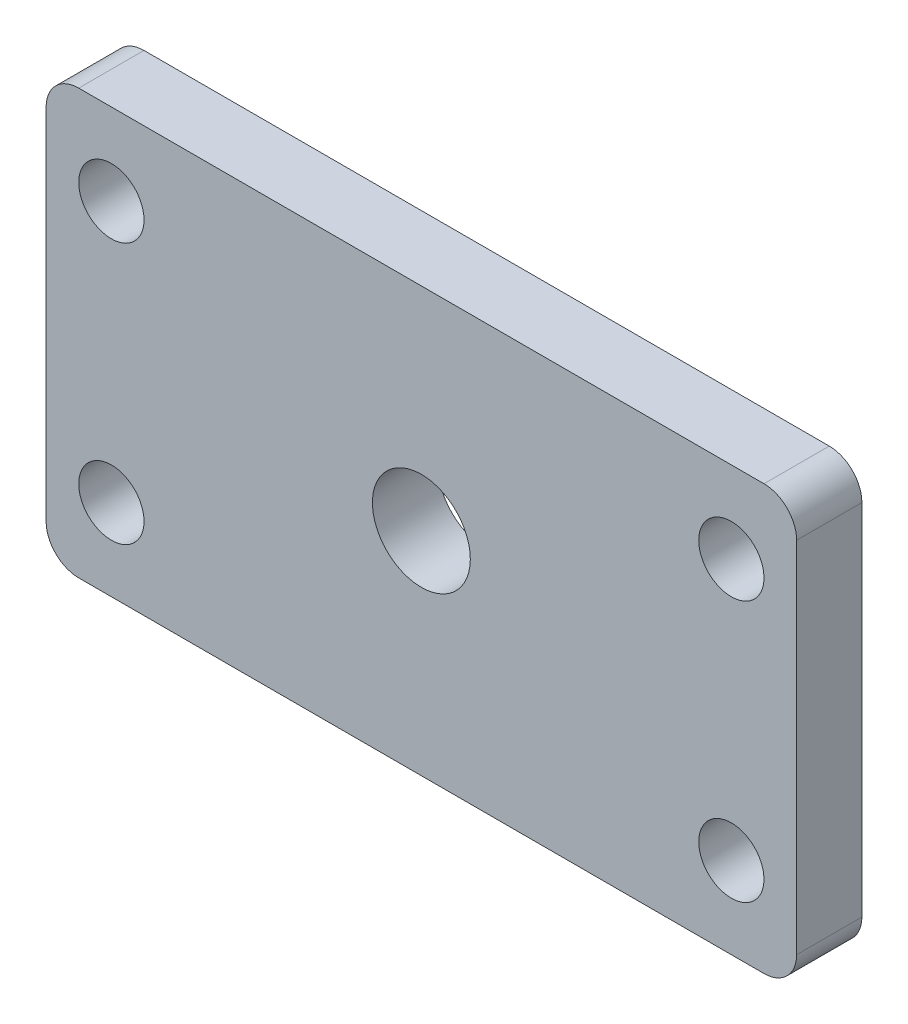
ISO-10303-21;
HEADER;
FILE_DESCRIPTION(('STEP AP214'),'2;1');
FILE_NAME('part.step','',(''),(''),'','','');
FILE_SCHEMA(('AUTOMOTIVE_DESIGN { 1 0 10303 214 1 1 1 1 }'));
ENDSEC;
DATA;
#1=APPLICATION_CONTEXT('core data for automotive mechanical design processes');
#2=APPLICATION_PROTOCOL_DEFINITION('international standard','automotive_design',2000,#1);
#3=PRODUCT_CONTEXT('',#1,'mechanical');
#4=PRODUCT('Part','Part','',(#3));
#5=PRODUCT_RELATED_PRODUCT_CATEGORY('part','',(#4));
#6=PRODUCT_DEFINITION_FORMATION('','',#4);
#7=PRODUCT_DEFINITION_CONTEXT('part definition',#1,'design');
#8=PRODUCT_DEFINITION('design','',#6,#7);
#9=PRODUCT_DEFINITION_SHAPE('','',#8);
#10=(LENGTH_UNIT() NAMED_UNIT(*) SI_UNIT(.MILLI.,.METRE.));
#11=(NAMED_UNIT(*) PLANE_ANGLE_UNIT() SI_UNIT($,.RADIAN.));
#12=(NAMED_UNIT(*) SI_UNIT($,.STERADIAN.) SOLID_ANGLE_UNIT());
#13=UNCERTAINTY_MEASURE_WITH_UNIT(LENGTH_MEASURE(1.E-05),#10,'distance_accuracy_value','');
#14=(GEOMETRIC_REPRESENTATION_CONTEXT(3) GLOBAL_UNCERTAINTY_ASSIGNED_CONTEXT((#13)) GLOBAL_UNIT_ASSIGNED_CONTEXT((#10,
#11,#12)) REPRESENTATION_CONTEXT('',''));
#15=CARTESIAN_POINT('',(0.,0.,0.));
#16=DIRECTION('',(0.,0.,1.));
#17=DIRECTION('',(1.,0.,0.));
#18=AXIS2_PLACEMENT_3D('',#15,#16,#17);
#19=CARTESIAN_POINT('',(0.,0.,2.));
#20=DIRECTION('',(0.,0.,1.));
#21=DIRECTION('',(1.,0.,0.));
#22=AXIS2_PLACEMENT_3D('',#19,#20,#21);
#23=PLANE('',#22);
#24=CARTESIAN_POINT('',(9.5,4.,2.));
#25=DIRECTION('',(0.,0.,1.));
#26=DIRECTION('',(-1.,0.,0.));
#27=AXIS2_PLACEMENT_3D('',#24,#25,#26);
#28=CIRCLE('',#27,1.);
#29=CARTESIAN_POINT('',(8.5,4.,2.));
#30=VERTEX_POINT('',#29);
#31=EDGE_CURVE('E200',#30,#30,#28,.T.);
#32=ORIENTED_EDGE('',*,*,#31,.F.);
#33=EDGE_LOOP('',(#32));
#34=FACE_BOUND('',#33,.T.);
#35=CARTESIAN_POINT('',(-9.5,-4.,2.));
#36=DIRECTION('',(0.,0.,1.));
#37=DIRECTION('',(1.,0.,0.));
#38=AXIS2_PLACEMENT_3D('',#35,#36,#37);
#39=CIRCLE('',#38,1.);
#40=CARTESIAN_POINT('',(-8.5,-4.,2.));
#41=VERTEX_POINT('',#40);
#42=EDGE_CURVE('E188',#41,#41,#39,.T.);
#43=ORIENTED_EDGE('',*,*,#42,.F.);
#44=EDGE_LOOP('',(#43));
#45=FACE_BOUND('',#44,.T.);
#46=DIRECTION('',(0.,1.,0.));
#47=VECTOR('',#46,1.);
#48=CARTESIAN_POINT('',(11.5,6.5,2.));
#49=LINE('',#48,#47);
#50=CARTESIAN_POINT('',(11.5,-5.5,2.));
#51=VERTEX_POINT('',#50);
#52=CARTESIAN_POINT('',(11.5,5.5,2.));
#53=VERTEX_POINT('',#52);
#54=EDGE_CURVE('E142',#51,#53,#49,.T.);
#55=ORIENTED_EDGE('',*,*,#54,.T.);
#56=CARTESIAN_POINT('',(10.5,5.5,2.));
#57=DIRECTION('',(0.,0.,1.));
#58=DIRECTION('',(1.,0.,0.));
#59=AXIS2_PLACEMENT_3D('',#56,#57,#58);
#60=CIRCLE('',#59,1.);
#61=CARTESIAN_POINT('',(10.5,6.5,2.));
#62=VERTEX_POINT('',#61);
#63=EDGE_CURVE('E156',#53,#62,#60,.T.);
#64=ORIENTED_EDGE('',*,*,#63,.T.);
#65=DIRECTION('',(-1.,0.,0.));
#66=VECTOR('',#65,1.);
#67=CARTESIAN_POINT('',(-11.5,6.5,2.));
#68=LINE('',#67,#66);
#69=CARTESIAN_POINT('',(-10.5,6.5,2.));
#70=VERTEX_POINT('',#69);
#71=EDGE_CURVE('E123',#62,#70,#68,.T.);
#72=ORIENTED_EDGE('',*,*,#71,.T.);
#73=CARTESIAN_POINT('',(-10.5,5.5,2.));
#74=DIRECTION('',(0.,0.,1.));
#75=DIRECTION('',(1.,0.,0.));
#76=AXIS2_PLACEMENT_3D('',#73,#74,#75);
#77=CIRCLE('',#76,1.);
#78=CARTESIAN_POINT('',(-11.5,5.5,2.));
#79=VERTEX_POINT('',#78);
#80=EDGE_CURVE('E152',#70,#79,#77,.T.);
#81=ORIENTED_EDGE('',*,*,#80,.T.);
#82=DIRECTION('',(0.,-1.,0.));
#83=VECTOR('',#82,1.);
#84=CARTESIAN_POINT('',(-11.5,6.5,2.));
#85=LINE('',#84,#83);
#86=CARTESIAN_POINT('',(-11.5,-5.5,2.));
#87=VERTEX_POINT('',#86);
#88=EDGE_CURVE('E165',#79,#87,#85,.T.);
#89=ORIENTED_EDGE('',*,*,#88,.T.);
#90=CARTESIAN_POINT('',(-10.5,-5.5,2.));
#91=DIRECTION('',(0.,0.,1.));
#92=DIRECTION('',(1.,0.,0.));
#93=AXIS2_PLACEMENT_3D('',#90,#91,#92);
#94=CIRCLE('',#93,1.);
#95=CARTESIAN_POINT('',(-10.5,-6.5,2.));
#96=VERTEX_POINT('',#95);
#97=EDGE_CURVE('E58',#87,#96,#94,.T.);
#98=ORIENTED_EDGE('',*,*,#97,.T.);
#99=DIRECTION('',(1.,0.,0.));
#100=VECTOR('',#99,1.);
#101=CARTESIAN_POINT('',(-11.5,-6.5,2.));
#102=LINE('',#101,#100);
#103=CARTESIAN_POINT('',(10.5,-6.5,2.));
#104=VERTEX_POINT('',#103);
#105=EDGE_CURVE('E143',#96,#104,#102,.T.);
#106=ORIENTED_EDGE('',*,*,#105,.T.);
#107=CARTESIAN_POINT('',(10.5,-5.5,2.));
#108=DIRECTION('',(0.,0.,1.));
#109=DIRECTION('',(1.,0.,0.));
#110=AXIS2_PLACEMENT_3D('',#107,#108,#109);
#111=CIRCLE('',#110,1.);
#112=EDGE_CURVE('E154',#104,#51,#111,.T.);
#113=ORIENTED_EDGE('',*,*,#112,.T.);
#114=EDGE_LOOP('',(#55,#64,#72,#81,#89,#98,#106,#113));
#115=FACE_BOUND('',#114,.T.);
#116=CARTESIAN_POINT('',(-9.5,4.,2.));
#117=DIRECTION('',(0.,0.,1.));
#118=DIRECTION('',(1.,0.,0.));
#119=AXIS2_PLACEMENT_3D('',#116,#117,#118);
#120=CIRCLE('',#119,1.);
#121=CARTESIAN_POINT('',(-8.5,4.,2.));
#122=VERTEX_POINT('',#121);
#123=EDGE_CURVE('E137',#122,#122,#120,.T.);
#124=ORIENTED_EDGE('',*,*,#123,.F.);
#125=EDGE_LOOP('',(#124));
#126=FACE_BOUND('',#125,.T.);
#127=CARTESIAN_POINT('',(9.5,-4.,2.));
#128=DIRECTION('',(0.,0.,1.));
#129=DIRECTION('',(-1.,0.,0.));
#130=AXIS2_PLACEMENT_3D('',#127,#128,#129);
#131=CIRCLE('',#130,1.);
#132=CARTESIAN_POINT('',(8.5,-4.,2.));
#133=VERTEX_POINT('',#132);
#134=EDGE_CURVE('E194',#133,#133,#131,.T.);
#135=ORIENTED_EDGE('',*,*,#134,.F.);
#136=EDGE_LOOP('',(#135));
#137=FACE_BOUND('',#136,.T.);
#138=CARTESIAN_POINT('',(0.,0.,2.));
#139=DIRECTION('',(0.,0.,1.));
#140=DIRECTION('',(1.,0.,0.));
#141=AXIS2_PLACEMENT_3D('',#138,#139,#140);
#142=CIRCLE('',#141,1.5);
#143=CARTESIAN_POINT('',(1.5,0.,2.));
#144=VERTEX_POINT('',#143);
#145=EDGE_CURVE('E206',#144,#144,#142,.T.);
#146=ORIENTED_EDGE('',*,*,#145,.F.);
#147=EDGE_LOOP('',(#146));
#148=FACE_BOUND('',#147,.T.);
#149=ADVANCED_FACE('F36',(#34,#45,#115,#126,#137,#148),#23,.T.);
#150=CARTESIAN_POINT('',(0.,0.,0.));
#151=DIRECTION('',(0.,0.,1.));
#152=DIRECTION('',(1.,0.,0.));
#153=AXIS2_PLACEMENT_3D('',#150,#151,#152);
#154=PLANE('',#153);
#155=DIRECTION('',(-1.,0.,0.));
#156=VECTOR('',#155,1.);
#157=CARTESIAN_POINT('',(-11.5,6.5,0.));
#158=LINE('',#157,#156);
#159=CARTESIAN_POINT('',(10.5,6.5,0.));
#160=VERTEX_POINT('',#159);
#161=CARTESIAN_POINT('',(-10.5,6.5,0.));
#162=VERTEX_POINT('',#161);
#163=EDGE_CURVE('E120',#160,#162,#158,.T.);
#164=ORIENTED_EDGE('',*,*,#163,.F.);
#165=CARTESIAN_POINT('',(10.5,5.5,0.));
#166=DIRECTION('',(0.,0.,1.));
#167=DIRECTION('',(1.,0.,0.));
#168=AXIS2_PLACEMENT_3D('',#165,#166,#167);
#169=CIRCLE('',#168,1.);
#170=CARTESIAN_POINT('',(11.5,5.5,0.));
#171=VERTEX_POINT('',#170);
#172=EDGE_CURVE('E103',#160,#171,#169,.F.);
#173=ORIENTED_EDGE('',*,*,#172,.T.);
#174=DIRECTION('',(0.,1.,0.));
#175=VECTOR('',#174,1.);
#176=CARTESIAN_POINT('',(11.5,6.5,0.));
#177=LINE('',#176,#175);
#178=CARTESIAN_POINT('',(11.5,-5.5,0.));
#179=VERTEX_POINT('',#178);
#180=EDGE_CURVE('E132',#179,#171,#177,.T.);
#181=ORIENTED_EDGE('',*,*,#180,.F.);
#182=CARTESIAN_POINT('',(10.5,-5.5,0.));
#183=DIRECTION('',(0.,0.,1.));
#184=DIRECTION('',(1.,0.,0.));
#185=AXIS2_PLACEMENT_3D('',#182,#183,#184);
#186=CIRCLE('',#185,1.);
#187=CARTESIAN_POINT('',(10.5,-6.5,0.));
#188=VERTEX_POINT('',#187);
#189=EDGE_CURVE('E114',#179,#188,#186,.F.);
#190=ORIENTED_EDGE('',*,*,#189,.T.);
#191=DIRECTION('',(1.,0.,0.));
#192=VECTOR('',#191,1.);
#193=CARTESIAN_POINT('',(-11.5,-6.5,0.));
#194=LINE('',#193,#192);
#195=CARTESIAN_POINT('',(-10.5,-6.5,0.));
#196=VERTEX_POINT('',#195);
#197=EDGE_CURVE('E135',#196,#188,#194,.T.);
#198=ORIENTED_EDGE('',*,*,#197,.F.);
#199=CARTESIAN_POINT('',(-10.5,-5.5,0.));
#200=DIRECTION('',(0.,0.,1.));
#201=DIRECTION('',(1.,0.,0.));
#202=AXIS2_PLACEMENT_3D('',#199,#200,#201);
#203=CIRCLE('',#202,1.);
#204=CARTESIAN_POINT('',(-11.5,-5.5,0.));
#205=VERTEX_POINT('',#204);
#206=EDGE_CURVE('E124',#196,#205,#203,.F.);
#207=ORIENTED_EDGE('',*,*,#206,.T.);
#208=DIRECTION('',(0.,-1.,0.));
#209=VECTOR('',#208,1.);
#210=CARTESIAN_POINT('',(-11.5,6.5,0.));
#211=LINE('',#210,#209);
#212=CARTESIAN_POINT('',(-11.5,5.5,0.));
#213=VERTEX_POINT('',#212);
#214=EDGE_CURVE('E131',#213,#205,#211,.T.);
#215=ORIENTED_EDGE('',*,*,#214,.F.);
#216=CARTESIAN_POINT('',(-10.5,5.5,0.));
#217=DIRECTION('',(0.,0.,1.));
#218=DIRECTION('',(1.,0.,0.));
#219=AXIS2_PLACEMENT_3D('',#216,#217,#218);
#220=CIRCLE('',#219,1.);
#221=EDGE_CURVE('E130',#213,#162,#220,.F.);
#222=ORIENTED_EDGE('',*,*,#221,.T.);
#223=EDGE_LOOP('',(#164,#173,#181,#190,#198,#207,#215,#222));
#224=FACE_BOUND('',#223,.T.);
#225=CARTESIAN_POINT('',(-9.5,4.,0.));
#226=DIRECTION('',(0.,0.,1.));
#227=DIRECTION('',(1.,0.,0.));
#228=AXIS2_PLACEMENT_3D('',#225,#226,#227);
#229=CIRCLE('',#228,1.);
#230=CARTESIAN_POINT('',(-8.5,4.,0.));
#231=VERTEX_POINT('',#230);
#232=EDGE_CURVE('E185',#231,#231,#229,.T.);
#233=ORIENTED_EDGE('',*,*,#232,.T.);
#234=EDGE_LOOP('',(#233));
#235=FACE_BOUND('',#234,.T.);
#236=CARTESIAN_POINT('',(-9.5,-4.,0.));
#237=DIRECTION('',(0.,0.,1.));
#238=DIRECTION('',(1.,0.,0.));
#239=AXIS2_PLACEMENT_3D('',#236,#237,#238);
#240=CIRCLE('',#239,1.);
#241=CARTESIAN_POINT('',(-8.5,-4.,0.));
#242=VERTEX_POINT('',#241);
#243=EDGE_CURVE('E191',#242,#242,#240,.T.);
#244=ORIENTED_EDGE('',*,*,#243,.T.);
#245=EDGE_LOOP('',(#244));
#246=FACE_BOUND('',#245,.T.);
#247=CARTESIAN_POINT('',(9.5,-4.,0.));
#248=DIRECTION('',(0.,0.,1.));
#249=DIRECTION('',(-1.,0.,0.));
#250=AXIS2_PLACEMENT_3D('',#247,#248,#249);
#251=CIRCLE('',#250,1.);
#252=CARTESIAN_POINT('',(8.5,-4.,0.));
#253=VERTEX_POINT('',#252);
#254=EDGE_CURVE('E197',#253,#253,#251,.T.);
#255=ORIENTED_EDGE('',*,*,#254,.T.);
#256=EDGE_LOOP('',(#255));
#257=FACE_BOUND('',#256,.T.);
#258=CARTESIAN_POINT('',(9.5,4.,0.));
#259=DIRECTION('',(0.,0.,1.));
#260=DIRECTION('',(-1.,0.,0.));
#261=AXIS2_PLACEMENT_3D('',#258,#259,#260);
#262=CIRCLE('',#261,1.);
#263=CARTESIAN_POINT('',(8.5,4.,0.));
#264=VERTEX_POINT('',#263);
#265=EDGE_CURVE('E203',#264,#264,#262,.T.);
#266=ORIENTED_EDGE('',*,*,#265,.T.);
#267=EDGE_LOOP('',(#266));
#268=FACE_BOUND('',#267,.T.);
#269=CARTESIAN_POINT('',(0.,0.,0.));
#270=DIRECTION('',(0.,0.,1.));
#271=DIRECTION('',(1.,0.,0.));
#272=AXIS2_PLACEMENT_3D('',#269,#270,#271);
#273=CIRCLE('',#272,1.5);
#274=CARTESIAN_POINT('',(1.5,0.,0.));
#275=VERTEX_POINT('',#274);
#276=EDGE_CURVE('E209',#275,#275,#273,.T.);
#277=ORIENTED_EDGE('',*,*,#276,.T.);
#278=EDGE_LOOP('',(#277));
#279=FACE_BOUND('',#278,.T.);
#280=ADVANCED_FACE('F127',(#224,#235,#246,#257,#268,#279),#154,.F.);
#281=CARTESIAN_POINT('',(11.5,6.5,2.));
#282=DIRECTION('',(-1.,0.,0.));
#283=DIRECTION('',(0.,0.,1.));
#284=AXIS2_PLACEMENT_3D('',#281,#282,#283);
#285=PLANE('',#284);
#286=ORIENTED_EDGE('',*,*,#180,.T.);
#287=DIRECTION('',(0.,0.,-1.));
#288=VECTOR('',#287,1.);
#289=CARTESIAN_POINT('',(11.5,5.5,2.));
#290=LINE('',#289,#288);
#291=EDGE_CURVE('E108',#171,#53,#290,.F.);
#292=ORIENTED_EDGE('',*,*,#291,.T.);
#293=ORIENTED_EDGE('',*,*,#54,.F.);
#294=DIRECTION('',(0.,0.,-1.));
#295=VECTOR('',#294,1.);
#296=CARTESIAN_POINT('',(11.5,-5.5,2.));
#297=LINE('',#296,#295);
#298=EDGE_CURVE('E113',#51,#179,#297,.T.);
#299=ORIENTED_EDGE('',*,*,#298,.T.);
#300=EDGE_LOOP('',(#286,#292,#293,#299));
#301=FACE_BOUND('',#300,.T.);
#302=ADVANCED_FACE('F181',(#301),#285,.F.);
#303=CARTESIAN_POINT('',(-11.5,6.5,2.));
#304=DIRECTION('',(0.,-1.,0.));
#305=DIRECTION('',(1.,0.,0.));
#306=AXIS2_PLACEMENT_3D('',#303,#304,#305);
#307=PLANE('',#306);
#308=ORIENTED_EDGE('',*,*,#71,.F.);
#309=DIRECTION('',(0.,0.,-1.));
#310=VECTOR('',#309,1.);
#311=CARTESIAN_POINT('',(10.5,6.5,2.));
#312=LINE('',#311,#310);
#313=EDGE_CURVE('E107',#62,#160,#312,.T.);
#314=ORIENTED_EDGE('',*,*,#313,.T.);
#315=ORIENTED_EDGE('',*,*,#163,.T.);
#316=DIRECTION('',(0.,0.,-1.));
#317=VECTOR('',#316,1.);
#318=CARTESIAN_POINT('',(-10.5,6.5,2.));
#319=LINE('',#318,#317);
#320=EDGE_CURVE('E125',#162,#70,#319,.F.);
#321=ORIENTED_EDGE('',*,*,#320,.T.);
#322=EDGE_LOOP('',(#308,#314,#315,#321));
#323=FACE_BOUND('',#322,.T.);
#324=ADVANCED_FACE('F119',(#323),#307,.F.);
#325=CARTESIAN_POINT('',(-11.5,6.5,2.));
#326=DIRECTION('',(1.,0.,0.));
#327=DIRECTION('',(0.,1.,0.));
#328=AXIS2_PLACEMENT_3D('',#325,#326,#327);
#329=PLANE('',#328);
#330=ORIENTED_EDGE('',*,*,#88,.F.);
#331=DIRECTION('',(0.,0.,-1.));
#332=VECTOR('',#331,1.);
#333=CARTESIAN_POINT('',(-11.5,5.5,2.));
#334=LINE('',#333,#332);
#335=EDGE_CURVE('E11',#79,#213,#334,.T.);
#336=ORIENTED_EDGE('',*,*,#335,.T.);
#337=ORIENTED_EDGE('',*,*,#214,.T.);
#338=DIRECTION('',(0.,0.,-1.));
#339=VECTOR('',#338,1.);
#340=CARTESIAN_POINT('',(-11.5,-5.5,2.));
#341=LINE('',#340,#339);
#342=EDGE_CURVE('E44',#205,#87,#341,.F.);
#343=ORIENTED_EDGE('',*,*,#342,.T.);
#344=EDGE_LOOP('',(#330,#336,#337,#343));
#345=FACE_BOUND('',#344,.T.);
#346=ADVANCED_FACE('F164',(#345),#329,.F.);
#347=CARTESIAN_POINT('',(-11.5,-6.5,2.));
#348=DIRECTION('',(0.,1.,0.));
#349=DIRECTION('',(-1.,0.,0.));
#350=AXIS2_PLACEMENT_3D('',#347,#348,#349);
#351=PLANE('',#350);
#352=ORIENTED_EDGE('',*,*,#197,.T.);
#353=DIRECTION('',(0.,0.,-1.));
#354=VECTOR('',#353,1.);
#355=CARTESIAN_POINT('',(10.5,-6.5,2.));
#356=LINE('',#355,#354);
#357=EDGE_CURVE('E51',#188,#104,#356,.F.);
#358=ORIENTED_EDGE('',*,*,#357,.T.);
#359=ORIENTED_EDGE('',*,*,#105,.F.);
#360=DIRECTION('',(0.,0.,-1.));
#361=VECTOR('',#360,1.);
#362=CARTESIAN_POINT('',(-10.5,-6.5,2.));
#363=LINE('',#362,#361);
#364=EDGE_CURVE('E158',#96,#196,#363,.T.);
#365=ORIENTED_EDGE('',*,*,#364,.T.);
#366=EDGE_LOOP('',(#352,#358,#359,#365));
#367=FACE_BOUND('',#366,.T.);
#368=ADVANCED_FACE('F174',(#367),#351,.F.);
#369=CARTESIAN_POINT('',(-9.5,4.,2.));
#370=DIRECTION('',(0.,0.,-1.));
#371=DIRECTION('',(-1.,0.,0.));
#372=AXIS2_PLACEMENT_3D('',#369,#370,#371);
#373=CYLINDRICAL_SURFACE('',#372,1.);
#374=ORIENTED_EDGE('',*,*,#123,.T.);
#375=EDGE_LOOP('',(#374));
#376=FACE_BOUND('',#375,.T.);
#377=ORIENTED_EDGE('',*,*,#232,.F.);
#378=EDGE_LOOP('',(#377));
#379=FACE_BOUND('',#378,.T.);
#380=ADVANCED_FACE('F228',(#376,#379),#373,.F.);
#381=CARTESIAN_POINT('',(-9.5,-4.,2.));
#382=DIRECTION('',(0.,0.,-1.));
#383=DIRECTION('',(-1.,0.,0.));
#384=AXIS2_PLACEMENT_3D('',#381,#382,#383);
#385=CYLINDRICAL_SURFACE('',#384,1.);
#386=ORIENTED_EDGE('',*,*,#42,.T.);
#387=EDGE_LOOP('',(#386));
#388=FACE_BOUND('',#387,.T.);
#389=ORIENTED_EDGE('',*,*,#243,.F.);
#390=EDGE_LOOP('',(#389));
#391=FACE_BOUND('',#390,.T.);
#392=ADVANCED_FACE('F330',(#388,#391),#385,.F.);
#393=CARTESIAN_POINT('',(9.5,-4.,2.));
#394=DIRECTION('',(0.,0.,-1.));
#395=DIRECTION('',(-1.,0.,0.));
#396=AXIS2_PLACEMENT_3D('',#393,#394,#395);
#397=CYLINDRICAL_SURFACE('',#396,1.);
#398=ORIENTED_EDGE('',*,*,#134,.T.);
#399=EDGE_LOOP('',(#398));
#400=FACE_BOUND('',#399,.T.);
#401=ORIENTED_EDGE('',*,*,#254,.F.);
#402=EDGE_LOOP('',(#401));
#403=FACE_BOUND('',#402,.T.);
#404=ADVANCED_FACE('F320',(#400,#403),#397,.F.);
#405=CARTESIAN_POINT('',(9.5,4.,2.));
#406=DIRECTION('',(0.,0.,-1.));
#407=DIRECTION('',(-1.,0.,0.));
#408=AXIS2_PLACEMENT_3D('',#405,#406,#407);
#409=CYLINDRICAL_SURFACE('',#408,1.);
#410=ORIENTED_EDGE('',*,*,#31,.T.);
#411=EDGE_LOOP('',(#410));
#412=FACE_BOUND('',#411,.T.);
#413=ORIENTED_EDGE('',*,*,#265,.F.);
#414=EDGE_LOOP('',(#413));
#415=FACE_BOUND('',#414,.T.);
#416=ADVANCED_FACE('F311',(#412,#415),#409,.F.);
#417=CARTESIAN_POINT('',(0.,0.,2.));
#418=DIRECTION('',(0.,0.,-1.));
#419=DIRECTION('',(-1.,0.,0.));
#420=AXIS2_PLACEMENT_3D('',#417,#418,#419);
#421=CYLINDRICAL_SURFACE('',#420,1.5);
#422=ORIENTED_EDGE('',*,*,#145,.T.);
#423=EDGE_LOOP('',(#422));
#424=FACE_BOUND('',#423,.T.);
#425=ORIENTED_EDGE('',*,*,#276,.F.);
#426=EDGE_LOOP('',(#425));
#427=FACE_BOUND('',#426,.T.);
#428=ADVANCED_FACE('F215',(#424,#427),#421,.F.);
#429=CARTESIAN_POINT('',(10.5,5.5,2.));
#430=DIRECTION('',(0.,0.,-1.));
#431=DIRECTION('',(-1.,0.,0.));
#432=AXIS2_PLACEMENT_3D('',#429,#430,#431);
#433=CYLINDRICAL_SURFACE('',#432,1.);
#434=ORIENTED_EDGE('',*,*,#63,.F.);
#435=ORIENTED_EDGE('',*,*,#291,.F.);
#436=ORIENTED_EDGE('',*,*,#172,.F.);
#437=ORIENTED_EDGE('',*,*,#313,.F.);
#438=EDGE_LOOP('',(#434,#435,#436,#437));
#439=FACE_BOUND('',#438,.T.);
#440=ADVANCED_FACE('F106',(#439),#433,.T.);
#441=CARTESIAN_POINT('',(10.5,-5.5,2.));
#442=DIRECTION('',(0.,0.,-1.));
#443=DIRECTION('',(-1.,0.,0.));
#444=AXIS2_PLACEMENT_3D('',#441,#442,#443);
#445=CYLINDRICAL_SURFACE('',#444,1.);
#446=ORIENTED_EDGE('',*,*,#112,.F.);
#447=ORIENTED_EDGE('',*,*,#357,.F.);
#448=ORIENTED_EDGE('',*,*,#189,.F.);
#449=ORIENTED_EDGE('',*,*,#298,.F.);
#450=EDGE_LOOP('',(#446,#447,#448,#449));
#451=FACE_BOUND('',#450,.T.);
#452=ADVANCED_FACE('F178',(#451),#445,.T.);
#453=CARTESIAN_POINT('',(-10.5,5.5,2.));
#454=DIRECTION('',(0.,0.,-1.));
#455=DIRECTION('',(-1.,0.,0.));
#456=AXIS2_PLACEMENT_3D('',#453,#454,#455);
#457=CYLINDRICAL_SURFACE('',#456,1.);
#458=ORIENTED_EDGE('',*,*,#80,.F.);
#459=ORIENTED_EDGE('',*,*,#320,.F.);
#460=ORIENTED_EDGE('',*,*,#221,.F.);
#461=ORIENTED_EDGE('',*,*,#335,.F.);
#462=EDGE_LOOP('',(#458,#459,#460,#461));
#463=FACE_BOUND('',#462,.T.);
#464=ADVANCED_FACE('F242',(#463),#457,.T.);
#465=CARTESIAN_POINT('',(-10.5,-5.5,2.));
#466=DIRECTION('',(0.,0.,-1.));
#467=DIRECTION('',(-1.,0.,0.));
#468=AXIS2_PLACEMENT_3D('',#465,#466,#467);
#469=CYLINDRICAL_SURFACE('',#468,1.);
#470=ORIENTED_EDGE('',*,*,#97,.F.);
#471=ORIENTED_EDGE('',*,*,#342,.F.);
#472=ORIENTED_EDGE('',*,*,#206,.F.);
#473=ORIENTED_EDGE('',*,*,#364,.F.);
#474=EDGE_LOOP('',(#470,#471,#472,#473));
#475=FACE_BOUND('',#474,.T.);
#476=ADVANCED_FACE('F38',(#475),#469,.T.);
#477=CLOSED_SHELL('',(#149,#280,#302,#324,#346,#368,#380,#392,#404,#416,#428,#440,#452,#464,#476));
#478=MANIFOLD_SOLID_BREP('B2',#477);
#479=ADVANCED_BREP_SHAPE_REPRESENTATION('',(#18,#478),#14);
#480=SHAPE_DEFINITION_REPRESENTATION(#9,#479);
ENDSEC;
END-ISO-10303-21;
